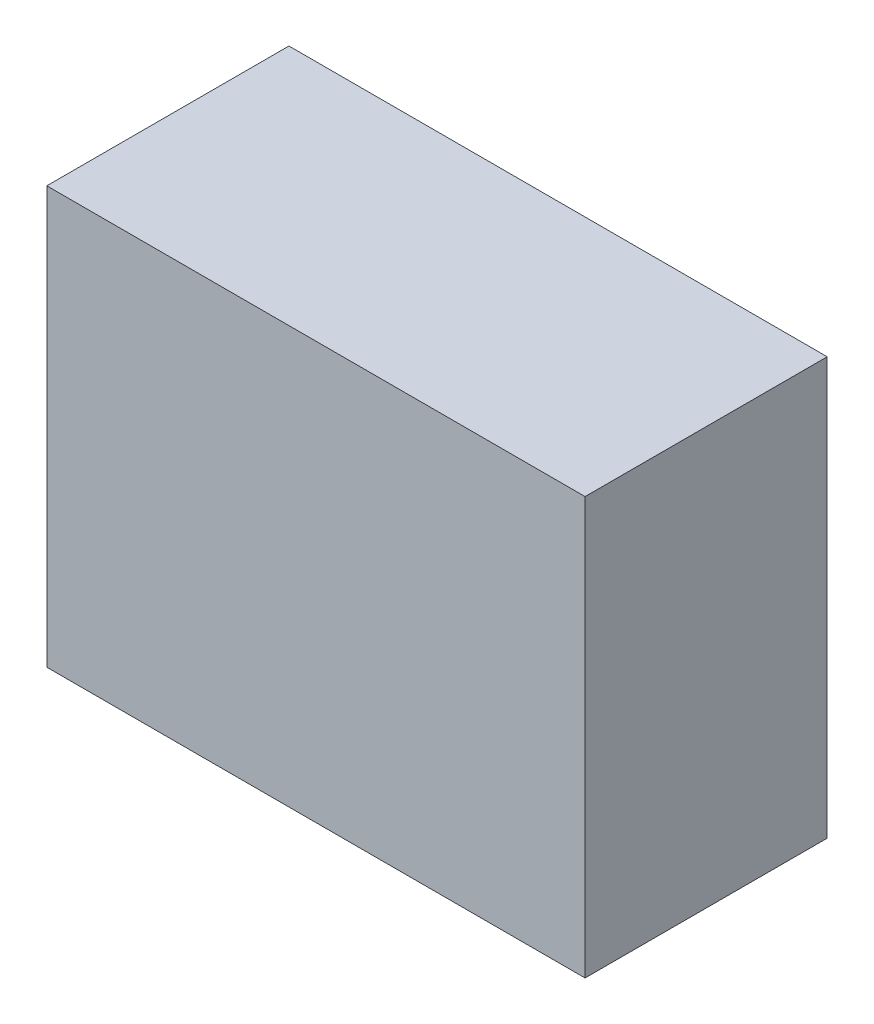
ISO-10303-21;
HEADER;
FILE_DESCRIPTION(('STEP AP214'),'2;1');
FILE_NAME('part.step','',(''),(''),'','','');
FILE_SCHEMA(('AUTOMOTIVE_DESIGN { 1 0 10303 214 1 1 1 1 }'));
ENDSEC;
DATA;
#1=APPLICATION_CONTEXT('core data for automotive mechanical design processes');
#2=APPLICATION_PROTOCOL_DEFINITION('international standard','automotive_design',2000,#1);
#3=PRODUCT_CONTEXT('',#1,'mechanical');
#4=PRODUCT('Part','Part','',(#3));
#5=PRODUCT_RELATED_PRODUCT_CATEGORY('part','',(#4));
#6=PRODUCT_DEFINITION_FORMATION('','',#4);
#7=PRODUCT_DEFINITION_CONTEXT('part definition',#1,'design');
#8=PRODUCT_DEFINITION('design','',#6,#7);
#9=PRODUCT_DEFINITION_SHAPE('','',#8);
#10=(LENGTH_UNIT() NAMED_UNIT(*) SI_UNIT(.MILLI.,.METRE.));
#11=(NAMED_UNIT(*) PLANE_ANGLE_UNIT() SI_UNIT($,.RADIAN.));
#12=(NAMED_UNIT(*) SI_UNIT($,.STERADIAN.) SOLID_ANGLE_UNIT());
#13=UNCERTAINTY_MEASURE_WITH_UNIT(LENGTH_MEASURE(1.E-05),#10,'distance_accuracy_value','');
#14=(GEOMETRIC_REPRESENTATION_CONTEXT(3) GLOBAL_UNCERTAINTY_ASSIGNED_CONTEXT((#13)) GLOBAL_UNIT_ASSIGNED_CONTEXT((#10,
#11,#12)) REPRESENTATION_CONTEXT('',''));
#15=CARTESIAN_POINT('',(0.,0.,0.));
#16=DIRECTION('',(0.,0.,1.));
#17=DIRECTION('',(1.,0.,0.));
#18=AXIS2_PLACEMENT_3D('',#15,#16,#17);
#19=CARTESIAN_POINT('',(-5.079492,3.93449302,4.57000102));
#20=DIRECTION('',(0.,0.,-1.));
#21=DIRECTION('',(-1.,0.,0.));
#22=AXIS2_PLACEMENT_3D('',#19,#20,#21);
#23=PLANE('',#22);
#24=DIRECTION('',(1.,0.,0.));
#25=VECTOR('',#24,1.);
#26=CARTESIAN_POINT('',(-5.079492,-3.93449302,4.57000102));
#27=LINE('',#26,#25);
#28=CARTESIAN_POINT('',(-5.079492,-3.93449302,4.57000102));
#29=VERTEX_POINT('',#28);
#30=CARTESIAN_POINT('',(5.079492,-3.93449302,4.57000102));
#31=VERTEX_POINT('',#30);
#32=EDGE_CURVE('E55',#29,#31,#27,.T.);
#33=ORIENTED_EDGE('',*,*,#32,.T.);
#34=DIRECTION('',(0.,1.,0.));
#35=VECTOR('',#34,1.);
#36=CARTESIAN_POINT('',(5.079492,-3.93449302,4.57000102));
#37=LINE('',#36,#35);
#38=CARTESIAN_POINT('',(5.079492,3.93449302,4.57000102));
#39=VERTEX_POINT('',#38);
#40=EDGE_CURVE('E57',#31,#39,#37,.T.);
#41=ORIENTED_EDGE('',*,*,#40,.T.);
#42=DIRECTION('',(1.,0.,0.));
#43=VECTOR('',#42,1.);
#44=CARTESIAN_POINT('',(5.079492,3.93449302,4.57000102));
#45=LINE('',#44,#43);
#46=CARTESIAN_POINT('',(-5.079492,3.93449302,4.57000102));
#47=VERTEX_POINT('',#46);
#48=EDGE_CURVE('E20',#39,#47,#45,.F.);
#49=ORIENTED_EDGE('',*,*,#48,.T.);
#50=DIRECTION('',(0.,1.,0.));
#51=VECTOR('',#50,1.);
#52=CARTESIAN_POINT('',(-5.079492,3.93449302,4.57000102));
#53=LINE('',#52,#51);
#54=EDGE_CURVE('E80',#47,#29,#53,.F.);
#55=ORIENTED_EDGE('',*,*,#54,.T.);
#56=EDGE_LOOP('',(#33,#41,#49,#55));
#57=FACE_BOUND('',#56,.T.);
#58=ADVANCED_FACE('F17',(#57),#23,.F.);
#59=CARTESIAN_POINT('',(5.079492,3.93449302,0.));
#60=DIRECTION('',(0.,-1.,0.));
#61=DIRECTION('',(0.,0.,-1.));
#62=AXIS2_PLACEMENT_3D('',#59,#60,#61);
#63=PLANE('',#62);
#64=DIRECTION('',(0.,0.,-1.));
#65=VECTOR('',#64,1.);
#66=CARTESIAN_POINT('',(-5.079492,3.93449302,0.));
#67=LINE('',#66,#65);
#68=CARTESIAN_POINT('',(-5.079492,3.93449302,0.));
#69=VERTEX_POINT('',#68);
#70=EDGE_CURVE('E68',#69,#47,#67,.F.);
#71=ORIENTED_EDGE('',*,*,#70,.T.);
#72=ORIENTED_EDGE('',*,*,#48,.F.);
#73=DIRECTION('',(0.,0.,1.));
#74=VECTOR('',#73,1.);
#75=CARTESIAN_POINT('',(5.079492,3.93449302,0.));
#76=LINE('',#75,#74);
#77=CARTESIAN_POINT('',(5.079492,3.93449302,0.));
#78=VERTEX_POINT('',#77);
#79=EDGE_CURVE('E63',#39,#78,#76,.F.);
#80=ORIENTED_EDGE('',*,*,#79,.T.);
#81=DIRECTION('',(-1.,0.,0.));
#82=VECTOR('',#81,1.);
#83=CARTESIAN_POINT('',(-5.079492,3.93449302,0.));
#84=LINE('',#83,#82);
#85=EDGE_CURVE('E83',#69,#78,#84,.F.);
#86=ORIENTED_EDGE('',*,*,#85,.F.);
#87=EDGE_LOOP('',(#71,#72,#80,#86));
#88=FACE_BOUND('',#87,.T.);
#89=ADVANCED_FACE('F65',(#88),#63,.F.);
#90=CARTESIAN_POINT('',(5.079492,-3.93449302,0.));
#91=DIRECTION('',(-1.,0.,0.));
#92=DIRECTION('',(0.,0.,1.));
#93=AXIS2_PLACEMENT_3D('',#90,#91,#92);
#94=PLANE('',#93);
#95=ORIENTED_EDGE('',*,*,#79,.F.);
#96=ORIENTED_EDGE('',*,*,#40,.F.);
#97=DIRECTION('',(0.,0.,1.));
#98=VECTOR('',#97,1.);
#99=CARTESIAN_POINT('',(5.079492,-3.93449302,0.));
#100=LINE('',#99,#98);
#101=CARTESIAN_POINT('',(5.079492,-3.93449302,0.));
#102=VERTEX_POINT('',#101);
#103=EDGE_CURVE('E75',#31,#102,#100,.F.);
#104=ORIENTED_EDGE('',*,*,#103,.T.);
#105=DIRECTION('',(0.,1.,0.));
#106=VECTOR('',#105,1.);
#107=CARTESIAN_POINT('',(5.079492,3.93449302,0.));
#108=LINE('',#107,#106);
#109=EDGE_CURVE('E72',#78,#102,#108,.F.);
#110=ORIENTED_EDGE('',*,*,#109,.F.);
#111=EDGE_LOOP('',(#95,#96,#104,#110));
#112=FACE_BOUND('',#111,.T.);
#113=ADVANCED_FACE('F70',(#112),#94,.F.);
#114=CARTESIAN_POINT('',(-5.079492,-3.93449302,0.));
#115=DIRECTION('',(0.,1.,0.));
#116=DIRECTION('',(0.,0.,1.));
#117=AXIS2_PLACEMENT_3D('',#114,#115,#116);
#118=PLANE('',#117);
#119=ORIENTED_EDGE('',*,*,#103,.F.);
#120=ORIENTED_EDGE('',*,*,#32,.F.);
#121=DIRECTION('',(0.,0.,-1.));
#122=VECTOR('',#121,1.);
#123=CARTESIAN_POINT('',(-5.079492,-3.93449302,0.));
#124=LINE('',#123,#122);
#125=CARTESIAN_POINT('',(-5.079492,-3.93449302,0.));
#126=VERTEX_POINT('',#125);
#127=EDGE_CURVE('E35',#29,#126,#124,.T.);
#128=ORIENTED_EDGE('',*,*,#127,.T.);
#129=DIRECTION('',(-1.,0.,0.));
#130=VECTOR('',#129,1.);
#131=CARTESIAN_POINT('',(-5.079492,-3.93449302,0.));
#132=LINE('',#131,#130);
#133=EDGE_CURVE('E26',#102,#126,#132,.T.);
#134=ORIENTED_EDGE('',*,*,#133,.F.);
#135=EDGE_LOOP('',(#119,#120,#128,#134));
#136=FACE_BOUND('',#135,.T.);
#137=ADVANCED_FACE('F89',(#136),#118,.F.);
#138=CARTESIAN_POINT('',(-5.079492,3.93449302,0.));
#139=DIRECTION('',(1.,0.,0.));
#140=DIRECTION('',(0.,0.,-1.));
#141=AXIS2_PLACEMENT_3D('',#138,#139,#140);
#142=PLANE('',#141);
#143=ORIENTED_EDGE('',*,*,#127,.F.);
#144=ORIENTED_EDGE('',*,*,#54,.F.);
#145=ORIENTED_EDGE('',*,*,#70,.F.);
#146=DIRECTION('',(0.,1.,0.));
#147=VECTOR('',#146,1.);
#148=CARTESIAN_POINT('',(-5.079492,3.93449302,0.));
#149=LINE('',#148,#147);
#150=EDGE_CURVE('E11',#126,#69,#149,.T.);
#151=ORIENTED_EDGE('',*,*,#150,.F.);
#152=EDGE_LOOP('',(#143,#144,#145,#151));
#153=FACE_BOUND('',#152,.T.);
#154=ADVANCED_FACE('F91',(#153),#142,.F.);
#155=CARTESIAN_POINT('',(-5.079492,3.93449302,0.));
#156=DIRECTION('',(0.,0.,-1.));
#157=DIRECTION('',(-1.,0.,0.));
#158=AXIS2_PLACEMENT_3D('',#155,#156,#157);
#159=PLANE('',#158);
#160=ORIENTED_EDGE('',*,*,#133,.T.);
#161=ORIENTED_EDGE('',*,*,#150,.T.);
#162=ORIENTED_EDGE('',*,*,#85,.T.);
#163=ORIENTED_EDGE('',*,*,#109,.T.);
#164=EDGE_LOOP('',(#160,#161,#162,#163));
#165=FACE_BOUND('',#164,.T.);
#166=ADVANCED_FACE('F88',(#165),#159,.T.);
#167=CLOSED_SHELL('',(#58,#89,#113,#137,#154,#166));
#168=MANIFOLD_SOLID_BREP('B1',#167);
#169=ADVANCED_BREP_SHAPE_REPRESENTATION('',(#18,#168),#14);
#170=SHAPE_DEFINITION_REPRESENTATION(#9,#169);
ENDSEC;
END-ISO-10303-21;
